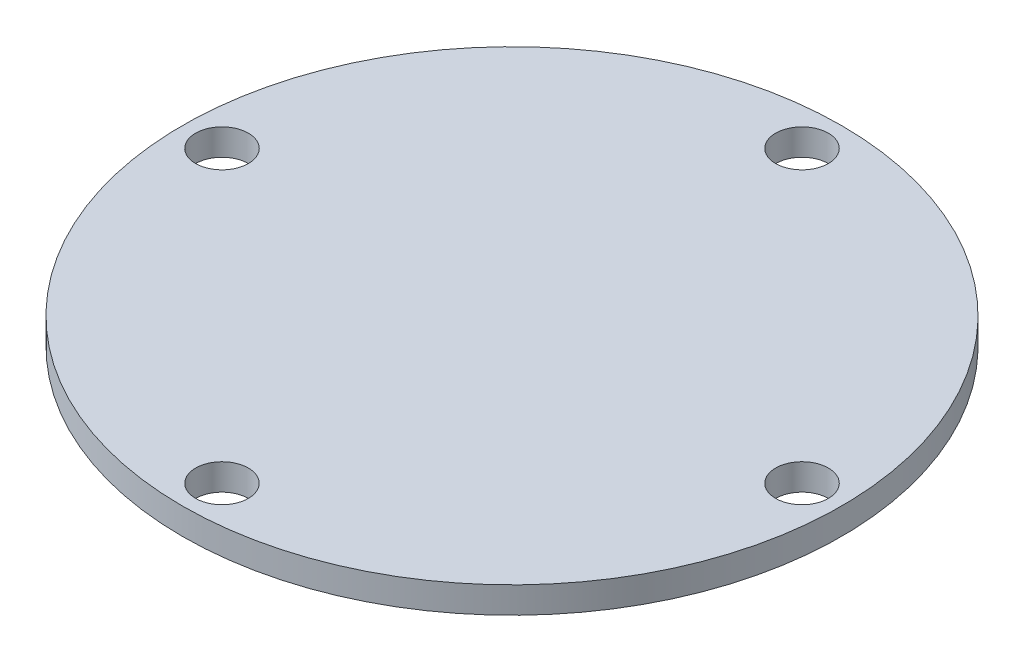
ISO-10303-21;
HEADER;
FILE_DESCRIPTION(('STEP AP214'),'2;1');
FILE_NAME('part.step','',(''),(''),'','','');
FILE_SCHEMA(('AUTOMOTIVE_DESIGN { 1 0 10303 214 1 1 1 1 }'));
ENDSEC;
DATA;
#1=APPLICATION_CONTEXT('core data for automotive mechanical design processes');
#2=APPLICATION_PROTOCOL_DEFINITION('international standard','automotive_design',2000,#1);
#3=PRODUCT_CONTEXT('',#1,'mechanical');
#4=PRODUCT('Part','Part','',(#3));
#5=PRODUCT_RELATED_PRODUCT_CATEGORY('part','',(#4));
#6=PRODUCT_DEFINITION_FORMATION('','',#4);
#7=PRODUCT_DEFINITION_CONTEXT('part definition',#1,'design');
#8=PRODUCT_DEFINITION('design','',#6,#7);
#9=PRODUCT_DEFINITION_SHAPE('','',#8);
#10=(LENGTH_UNIT() NAMED_UNIT(*) SI_UNIT(.MILLI.,.METRE.));
#11=(NAMED_UNIT(*) PLANE_ANGLE_UNIT() SI_UNIT($,.RADIAN.));
#12=(NAMED_UNIT(*) SI_UNIT($,.STERADIAN.) SOLID_ANGLE_UNIT());
#13=UNCERTAINTY_MEASURE_WITH_UNIT(LENGTH_MEASURE(1.E-05),#10,'distance_accuracy_value','');
#14=(GEOMETRIC_REPRESENTATION_CONTEXT(3) GLOBAL_UNCERTAINTY_ASSIGNED_CONTEXT((#13)) GLOBAL_UNIT_ASSIGNED_CONTEXT((#10,
#11,#12)) REPRESENTATION_CONTEXT('',''));
#15=CARTESIAN_POINT('',(0.,0.,0.));
#16=DIRECTION('',(0.,0.,1.));
#17=DIRECTION('',(1.,0.,0.));
#18=AXIS2_PLACEMENT_3D('',#15,#16,#17);
#19=CARTESIAN_POINT('',(0.,2.,0.));
#20=DIRECTION('',(0.,1.,0.));
#21=DIRECTION('',(0.,0.,1.));
#22=AXIS2_PLACEMENT_3D('',#19,#20,#21);
#23=PLANE('',#22);
#24=CARTESIAN_POINT('',(0.,2.,-22.));
#25=DIRECTION('',(0.,1.,0.));
#26=DIRECTION('',(0.,0.,1.));
#27=AXIS2_PLACEMENT_3D('',#24,#25,#26);
#28=CIRCLE('',#27,1.99880028905064);
#29=CARTESIAN_POINT('',(0.,2.,-20.0011997109494));
#30=VERTEX_POINT('',#29);
#31=EDGE_CURVE('E63',#30,#30,#28,.T.);
#32=ORIENTED_EDGE('',*,*,#31,.F.);
#33=EDGE_LOOP('',(#32));
#34=FACE_BOUND('',#33,.T.);
#35=CARTESIAN_POINT('',(0.,2.,22.));
#36=DIRECTION('',(0.,1.,0.));
#37=DIRECTION('',(0.,0.,1.));
#38=AXIS2_PLACEMENT_3D('',#35,#36,#37);
#39=CIRCLE('',#38,1.99880028905064);
#40=CARTESIAN_POINT('',(0.,2.,23.9988002890506));
#41=VERTEX_POINT('',#40);
#42=EDGE_CURVE('E57',#41,#41,#39,.T.);
#43=ORIENTED_EDGE('',*,*,#42,.F.);
#44=EDGE_LOOP('',(#43));
#45=FACE_BOUND('',#44,.T.);
#46=CARTESIAN_POINT('',(-22.,2.,0.));
#47=DIRECTION('',(0.,1.,0.));
#48=DIRECTION('',(0.,0.,1.));
#49=AXIS2_PLACEMENT_3D('',#46,#47,#48);
#50=CIRCLE('',#49,2.);
#51=CARTESIAN_POINT('',(-22.,2.,2.));
#52=VERTEX_POINT('',#51);
#53=EDGE_CURVE('E43',#52,#52,#50,.T.);
#54=ORIENTED_EDGE('',*,*,#53,.F.);
#55=EDGE_LOOP('',(#54));
#56=FACE_BOUND('',#55,.T.);
#57=CARTESIAN_POINT('',(0.,2.,0.));
#58=DIRECTION('',(0.,1.,0.));
#59=DIRECTION('',(0.,0.,1.));
#60=AXIS2_PLACEMENT_3D('',#57,#58,#59);
#61=CIRCLE('',#60,25.);
#62=CARTESIAN_POINT('',(0.,2.,25.));
#63=VERTEX_POINT('',#62);
#64=EDGE_CURVE('E10',#63,#63,#61,.T.);
#65=ORIENTED_EDGE('',*,*,#64,.T.);
#66=EDGE_LOOP('',(#65));
#67=FACE_BOUND('',#66,.T.);
#68=CARTESIAN_POINT('',(22.,2.,0.));
#69=DIRECTION('',(0.,1.,0.));
#70=DIRECTION('',(0.,0.,1.));
#71=AXIS2_PLACEMENT_3D('',#68,#69,#70);
#72=CIRCLE('',#71,2.);
#73=CARTESIAN_POINT('',(22.,2.,2.));
#74=VERTEX_POINT('',#73);
#75=EDGE_CURVE('E48',#74,#74,#72,.T.);
#76=ORIENTED_EDGE('',*,*,#75,.F.);
#77=EDGE_LOOP('',(#76));
#78=FACE_BOUND('',#77,.T.);
#79=ADVANCED_FACE('F32',(#34,#45,#56,#67,#78),#23,.T.);
#80=CARTESIAN_POINT('',(0.,0.,0.));
#81=DIRECTION('',(0.,1.,0.));
#82=DIRECTION('',(0.,0.,1.));
#83=AXIS2_PLACEMENT_3D('',#80,#81,#82);
#84=PLANE('',#83);
#85=CARTESIAN_POINT('',(0.,0.,-22.));
#86=DIRECTION('',(0.,1.,0.));
#87=DIRECTION('',(0.,0.,1.));
#88=AXIS2_PLACEMENT_3D('',#85,#86,#87);
#89=CIRCLE('',#88,1.99880028905064);
#90=CARTESIAN_POINT('',(0.,0.,-20.0011997109494));
#91=VERTEX_POINT('',#90);
#92=EDGE_CURVE('E54',#91,#91,#89,.T.);
#93=ORIENTED_EDGE('',*,*,#92,.T.);
#94=EDGE_LOOP('',(#93));
#95=FACE_BOUND('',#94,.T.);
#96=CARTESIAN_POINT('',(0.,0.,22.));
#97=DIRECTION('',(0.,1.,0.));
#98=DIRECTION('',(0.,0.,1.));
#99=AXIS2_PLACEMENT_3D('',#96,#97,#98);
#100=CIRCLE('',#99,1.99880028905064);
#101=CARTESIAN_POINT('',(0.,0.,23.9988002890506));
#102=VERTEX_POINT('',#101);
#103=EDGE_CURVE('E60',#102,#102,#100,.T.);
#104=ORIENTED_EDGE('',*,*,#103,.T.);
#105=EDGE_LOOP('',(#104));
#106=FACE_BOUND('',#105,.T.);
#107=CARTESIAN_POINT('',(0.,0.,0.));
#108=DIRECTION('',(0.,1.,0.));
#109=DIRECTION('',(0.,0.,1.));
#110=AXIS2_PLACEMENT_3D('',#107,#108,#109);
#111=CIRCLE('',#110,25.);
#112=CARTESIAN_POINT('',(0.,0.,25.));
#113=VERTEX_POINT('',#112);
#114=EDGE_CURVE('E36',#113,#113,#111,.T.);
#115=ORIENTED_EDGE('',*,*,#114,.F.);
#116=EDGE_LOOP('',(#115));
#117=FACE_BOUND('',#116,.T.);
#118=CARTESIAN_POINT('',(-22.,0.,0.));
#119=DIRECTION('',(0.,1.,0.));
#120=DIRECTION('',(0.,0.,1.));
#121=AXIS2_PLACEMENT_3D('',#118,#119,#120);
#122=CIRCLE('',#121,2.);
#123=CARTESIAN_POINT('',(-22.,0.,2.));
#124=VERTEX_POINT('',#123);
#125=EDGE_CURVE('E45',#124,#124,#122,.T.);
#126=ORIENTED_EDGE('',*,*,#125,.T.);
#127=EDGE_LOOP('',(#126));
#128=FACE_BOUND('',#127,.T.);
#129=CARTESIAN_POINT('',(22.,0.,0.));
#130=DIRECTION('',(0.,1.,0.));
#131=DIRECTION('',(0.,0.,1.));
#132=AXIS2_PLACEMENT_3D('',#129,#130,#131);
#133=CIRCLE('',#132,2.);
#134=CARTESIAN_POINT('',(22.,0.,2.));
#135=VERTEX_POINT('',#134);
#136=EDGE_CURVE('E51',#135,#135,#133,.T.);
#137=ORIENTED_EDGE('',*,*,#136,.T.);
#138=EDGE_LOOP('',(#137));
#139=FACE_BOUND('',#138,.T.);
#140=ADVANCED_FACE('F69',(#95,#106,#117,#128,#139),#84,.F.);
#141=CARTESIAN_POINT('',(0.,2.,0.));
#142=DIRECTION('',(0.,-1.,0.));
#143=DIRECTION('',(0.,0.,-1.));
#144=AXIS2_PLACEMENT_3D('',#141,#142,#143);
#145=CYLINDRICAL_SURFACE('',#144,25.);
#146=ORIENTED_EDGE('',*,*,#64,.F.);
#147=EDGE_LOOP('',(#146));
#148=FACE_BOUND('',#147,.T.);
#149=ORIENTED_EDGE('',*,*,#114,.T.);
#150=EDGE_LOOP('',(#149));
#151=FACE_BOUND('',#150,.T.);
#152=ADVANCED_FACE('F34',(#148,#151),#145,.T.);
#153=CARTESIAN_POINT('',(-22.,2.,0.));
#154=DIRECTION('',(0.,-1.,0.));
#155=DIRECTION('',(0.,0.,-1.));
#156=AXIS2_PLACEMENT_3D('',#153,#154,#155);
#157=CYLINDRICAL_SURFACE('',#156,2.);
#158=ORIENTED_EDGE('',*,*,#53,.T.);
#159=EDGE_LOOP('',(#158));
#160=FACE_BOUND('',#159,.T.);
#161=ORIENTED_EDGE('',*,*,#125,.F.);
#162=EDGE_LOOP('',(#161));
#163=FACE_BOUND('',#162,.T.);
#164=ADVANCED_FACE('F91',(#160,#163),#157,.F.);
#165=CARTESIAN_POINT('',(22.,2.,0.));
#166=DIRECTION('',(0.,-1.,0.));
#167=DIRECTION('',(0.,0.,-1.));
#168=AXIS2_PLACEMENT_3D('',#165,#166,#167);
#169=CYLINDRICAL_SURFACE('',#168,2.);
#170=ORIENTED_EDGE('',*,*,#75,.T.);
#171=EDGE_LOOP('',(#170));
#172=FACE_BOUND('',#171,.T.);
#173=ORIENTED_EDGE('',*,*,#136,.F.);
#174=EDGE_LOOP('',(#173));
#175=FACE_BOUND('',#174,.T.);
#176=ADVANCED_FACE('F88',(#172,#175),#169,.F.);
#177=CARTESIAN_POINT('',(0.,0.,22.));
#178=DIRECTION('',(0.,1.,0.));
#179=DIRECTION('',(0.,0.,1.));
#180=AXIS2_PLACEMENT_3D('',#177,#178,#179);
#181=CYLINDRICAL_SURFACE('',#180,1.99880028905064);
#182=ORIENTED_EDGE('',*,*,#103,.F.);
#183=EDGE_LOOP('',(#182));
#184=FACE_BOUND('',#183,.T.);
#185=ORIENTED_EDGE('',*,*,#42,.T.);
#186=EDGE_LOOP('',(#185));
#187=FACE_BOUND('',#186,.T.);
#188=ADVANCED_FACE('F75',(#184,#187),#181,.F.);
#189=CARTESIAN_POINT('',(0.,0.,-22.));
#190=DIRECTION('',(0.,1.,0.));
#191=DIRECTION('',(0.,0.,1.));
#192=AXIS2_PLACEMENT_3D('',#189,#190,#191);
#193=CYLINDRICAL_SURFACE('',#192,1.99880028905064);
#194=ORIENTED_EDGE('',*,*,#92,.F.);
#195=EDGE_LOOP('',(#194));
#196=FACE_BOUND('',#195,.T.);
#197=ORIENTED_EDGE('',*,*,#31,.T.);
#198=EDGE_LOOP('',(#197));
#199=FACE_BOUND('',#198,.T.);
#200=ADVANCED_FACE('F72',(#196,#199),#193,.F.);
#201=CLOSED_SHELL('',(#79,#140,#152,#164,#176,#188,#200));
#202=MANIFOLD_SOLID_BREP('B2',#201);
#203=ADVANCED_BREP_SHAPE_REPRESENTATION('',(#18,#202),#14);
#204=SHAPE_DEFINITION_REPRESENTATION(#9,#203);
ENDSEC;
END-ISO-10303-21;
